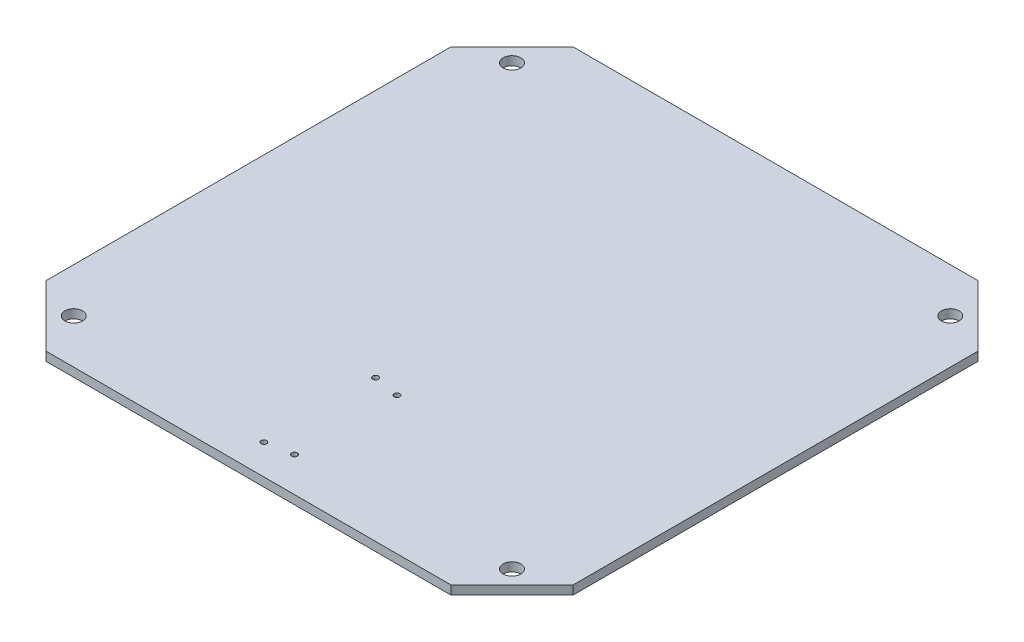
ISO-10303-21;
HEADER;
FILE_DESCRIPTION(('STEP AP214'),'2;1');
FILE_NAME('part.step','',(''),(''),'','','');
FILE_SCHEMA(('AUTOMOTIVE_DESIGN { 1 0 10303 214 1 1 1 1 }'));
ENDSEC;
DATA;
#1=APPLICATION_CONTEXT('core data for automotive mechanical design processes');
#2=APPLICATION_PROTOCOL_DEFINITION('international standard','automotive_design',2000,#1);
#3=PRODUCT_CONTEXT('',#1,'mechanical');
#4=PRODUCT('Part','Part','',(#3));
#5=PRODUCT_RELATED_PRODUCT_CATEGORY('part','',(#4));
#6=PRODUCT_DEFINITION_FORMATION('','',#4);
#7=PRODUCT_DEFINITION_CONTEXT('part definition',#1,'design');
#8=PRODUCT_DEFINITION('design','',#6,#7);
#9=PRODUCT_DEFINITION_SHAPE('','',#8);
#10=(LENGTH_UNIT() NAMED_UNIT(*) SI_UNIT(.MILLI.,.METRE.));
#11=(NAMED_UNIT(*) PLANE_ANGLE_UNIT() SI_UNIT($,.RADIAN.));
#12=(NAMED_UNIT(*) SI_UNIT($,.STERADIAN.) SOLID_ANGLE_UNIT());
#13=UNCERTAINTY_MEASURE_WITH_UNIT(LENGTH_MEASURE(1.E-05),#10,'distance_accuracy_value','');
#14=(GEOMETRIC_REPRESENTATION_CONTEXT(3) GLOBAL_UNCERTAINTY_ASSIGNED_CONTEXT((#13)) GLOBAL_UNIT_ASSIGNED_CONTEXT((#10,
#11,#12)) REPRESENTATION_CONTEXT('',''));
#15=CARTESIAN_POINT('',(0.,0.,0.));
#16=DIRECTION('',(0.,0.,1.));
#17=DIRECTION('',(1.,0.,0.));
#18=AXIS2_PLACEMENT_3D('',#15,#16,#17);
#19=CARTESIAN_POINT('',(-47.5,1.59,-36.5));
#20=DIRECTION('',(-0.707106781186547,0.,-0.707106781186547));
#21=DIRECTION('',(-0.707106781186548,0.,0.707106781186548));
#22=AXIS2_PLACEMENT_3D('',#19,#20,#21);
#23=PLANE('',#22);
#24=DIRECTION('',(0.707106781186547,0.,-0.707106781186547));
#25=VECTOR('',#24,1.);
#26=CARTESIAN_POINT('',(-47.5,0.,-36.5));
#27=LINE('',#26,#25);
#28=CARTESIAN_POINT('',(-47.5,0.,-36.5));
#29=VERTEX_POINT('',#28);
#30=CARTESIAN_POINT('',(-36.5,0.,-47.5));
#31=VERTEX_POINT('',#30);
#32=EDGE_CURVE('E142',#29,#31,#27,.T.);
#33=ORIENTED_EDGE('',*,*,#32,.F.);
#34=DIRECTION('',(0.,-1.,0.));
#35=VECTOR('',#34,1.);
#36=CARTESIAN_POINT('',(-47.5,1.59,-36.5));
#37=LINE('',#36,#35);
#38=CARTESIAN_POINT('',(-47.5,1.59,-36.5));
#39=VERTEX_POINT('',#38);
#40=EDGE_CURVE('E11',#39,#29,#37,.T.);
#41=ORIENTED_EDGE('',*,*,#40,.F.);
#42=DIRECTION('',(0.707106781186547,0.,-0.707106781186547));
#43=VECTOR('',#42,1.);
#44=CARTESIAN_POINT('',(-47.5,1.59,-36.5));
#45=LINE('',#44,#43);
#46=CARTESIAN_POINT('',(-36.5,1.59,-47.5));
#47=VERTEX_POINT('',#46);
#48=EDGE_CURVE('E170',#39,#47,#45,.T.);
#49=ORIENTED_EDGE('',*,*,#48,.T.);
#50=DIRECTION('',(0.,-1.,0.));
#51=VECTOR('',#50,1.);
#52=CARTESIAN_POINT('',(-36.5,1.59,-47.5));
#53=LINE('',#52,#51);
#54=EDGE_CURVE('E44',#47,#31,#53,.T.);
#55=ORIENTED_EDGE('',*,*,#54,.T.);
#56=EDGE_LOOP('',(#33,#41,#49,#55));
#57=FACE_BOUND('',#56,.T.);
#58=ADVANCED_FACE('F41',(#57),#23,.T.);
#59=CARTESIAN_POINT('',(-47.5,1.59,-36.5));
#60=DIRECTION('',(1.,0.,0.));
#61=DIRECTION('',(0.,0.,-1.));
#62=AXIS2_PLACEMENT_3D('',#59,#60,#61);
#63=PLANE('',#62);
#64=DIRECTION('',(0.,0.,1.));
#65=VECTOR('',#64,1.);
#66=CARTESIAN_POINT('',(-47.5,0.,-36.5));
#67=LINE('',#66,#65);
#68=CARTESIAN_POINT('',(-47.5,0.,36.5));
#69=VERTEX_POINT('',#68);
#70=EDGE_CURVE('E168',#29,#69,#67,.T.);
#71=ORIENTED_EDGE('',*,*,#70,.T.);
#72=DIRECTION('',(0.,-1.,0.));
#73=VECTOR('',#72,1.);
#74=CARTESIAN_POINT('',(-47.5,1.59,36.5));
#75=LINE('',#74,#73);
#76=CARTESIAN_POINT('',(-47.5,1.59,36.5));
#77=VERTEX_POINT('',#76);
#78=EDGE_CURVE('E51',#77,#69,#75,.T.);
#79=ORIENTED_EDGE('',*,*,#78,.F.);
#80=DIRECTION('',(0.,0.,1.));
#81=VECTOR('',#80,1.);
#82=CARTESIAN_POINT('',(-47.5,1.59,-36.5));
#83=LINE('',#82,#81);
#84=EDGE_CURVE('E135',#39,#77,#83,.T.);
#85=ORIENTED_EDGE('',*,*,#84,.F.);
#86=ORIENTED_EDGE('',*,*,#40,.T.);
#87=EDGE_LOOP('',(#71,#79,#85,#86));
#88=FACE_BOUND('',#87,.T.);
#89=ADVANCED_FACE('F188',(#88),#63,.F.);
#90=CARTESIAN_POINT('',(-36.5,1.59,47.5));
#91=DIRECTION('',(-0.707106781186547,0.,0.707106781186547));
#92=DIRECTION('',(0.707106781186548,0.,0.707106781186548));
#93=AXIS2_PLACEMENT_3D('',#90,#91,#92);
#94=PLANE('',#93);
#95=DIRECTION('',(-0.707106781186547,0.,-0.707106781186547));
#96=VECTOR('',#95,1.);
#97=CARTESIAN_POINT('',(-36.5,0.,47.5));
#98=LINE('',#97,#96);
#99=CARTESIAN_POINT('',(-36.5,0.,47.5));
#100=VERTEX_POINT('',#99);
#101=EDGE_CURVE('E117',#100,#69,#98,.T.);
#102=ORIENTED_EDGE('',*,*,#101,.F.);
#103=DIRECTION('',(0.,-1.,0.));
#104=VECTOR('',#103,1.);
#105=CARTESIAN_POINT('',(-36.5,1.59,47.5));
#106=LINE('',#105,#104);
#107=CARTESIAN_POINT('',(-36.5,1.59,47.5));
#108=VERTEX_POINT('',#107);
#109=EDGE_CURVE('E111',#108,#100,#106,.T.);
#110=ORIENTED_EDGE('',*,*,#109,.F.);
#111=DIRECTION('',(-0.707106781186547,0.,-0.707106781186547));
#112=VECTOR('',#111,1.);
#113=CARTESIAN_POINT('',(-36.5,1.59,47.5));
#114=LINE('',#113,#112);
#115=EDGE_CURVE('E115',#108,#77,#114,.T.);
#116=ORIENTED_EDGE('',*,*,#115,.T.);
#117=ORIENTED_EDGE('',*,*,#78,.T.);
#118=EDGE_LOOP('',(#102,#110,#116,#117));
#119=FACE_BOUND('',#118,.T.);
#120=ADVANCED_FACE('F113',(#119),#94,.T.);
#121=CARTESIAN_POINT('',(-36.5,1.59,47.5));
#122=DIRECTION('',(0.,0.,-1.));
#123=DIRECTION('',(-1.,0.,0.));
#124=AXIS2_PLACEMENT_3D('',#121,#122,#123);
#125=PLANE('',#124);
#126=DIRECTION('',(1.,0.,0.));
#127=VECTOR('',#126,1.);
#128=CARTESIAN_POINT('',(-36.5,0.,47.5));
#129=LINE('',#128,#127);
#130=CARTESIAN_POINT('',(36.5,0.,47.5));
#131=VERTEX_POINT('',#130);
#132=EDGE_CURVE('E163',#100,#131,#129,.T.);
#133=ORIENTED_EDGE('',*,*,#132,.T.);
#134=DIRECTION('',(0.,-1.,0.));
#135=VECTOR('',#134,1.);
#136=CARTESIAN_POINT('',(36.5,1.59,47.5));
#137=LINE('',#136,#135);
#138=CARTESIAN_POINT('',(36.5,1.59,47.5));
#139=VERTEX_POINT('',#138);
#140=EDGE_CURVE('E122',#139,#131,#137,.T.);
#141=ORIENTED_EDGE('',*,*,#140,.F.);
#142=DIRECTION('',(1.,0.,0.));
#143=VECTOR('',#142,1.);
#144=CARTESIAN_POINT('',(-36.5,1.59,47.5));
#145=LINE('',#144,#143);
#146=EDGE_CURVE('E125',#108,#139,#145,.T.);
#147=ORIENTED_EDGE('',*,*,#146,.F.);
#148=ORIENTED_EDGE('',*,*,#109,.T.);
#149=EDGE_LOOP('',(#133,#141,#147,#148));
#150=FACE_BOUND('',#149,.T.);
#151=ADVANCED_FACE('F126',(#150),#125,.F.);
#152=CARTESIAN_POINT('',(47.5,1.59,36.5));
#153=DIRECTION('',(0.707106781186547,0.,0.707106781186547));
#154=DIRECTION('',(0.707106781186548,0.,-0.707106781186548));
#155=AXIS2_PLACEMENT_3D('',#152,#153,#154);
#156=PLANE('',#155);
#157=DIRECTION('',(-0.707106781186547,0.,0.707106781186547));
#158=VECTOR('',#157,1.);
#159=CARTESIAN_POINT('',(47.5,0.,36.5));
#160=LINE('',#159,#158);
#161=CARTESIAN_POINT('',(47.5,0.,36.5));
#162=VERTEX_POINT('',#161);
#163=EDGE_CURVE('E159',#162,#131,#160,.T.);
#164=ORIENTED_EDGE('',*,*,#163,.F.);
#165=DIRECTION('',(0.,-1.,0.));
#166=VECTOR('',#165,1.);
#167=CARTESIAN_POINT('',(47.5,1.59,36.5));
#168=LINE('',#167,#166);
#169=CARTESIAN_POINT('',(47.5,1.59,36.5));
#170=VERTEX_POINT('',#169);
#171=EDGE_CURVE('E176',#170,#162,#168,.T.);
#172=ORIENTED_EDGE('',*,*,#171,.F.);
#173=DIRECTION('',(-0.707106781186547,0.,0.707106781186547));
#174=VECTOR('',#173,1.);
#175=CARTESIAN_POINT('',(47.5,1.59,36.5));
#176=LINE('',#175,#174);
#177=EDGE_CURVE('E131',#170,#139,#176,.T.);
#178=ORIENTED_EDGE('',*,*,#177,.T.);
#179=ORIENTED_EDGE('',*,*,#140,.T.);
#180=EDGE_LOOP('',(#164,#172,#178,#179));
#181=FACE_BOUND('',#180,.T.);
#182=ADVANCED_FACE('F209',(#181),#156,.T.);
#183=CARTESIAN_POINT('',(47.5,1.59,-36.5));
#184=DIRECTION('',(1.,0.,0.));
#185=DIRECTION('',(0.,0.,-1.));
#186=AXIS2_PLACEMENT_3D('',#183,#184,#185);
#187=PLANE('',#186);
#188=DIRECTION('',(0.,0.,1.));
#189=VECTOR('',#188,1.);
#190=CARTESIAN_POINT('',(47.5,0.,-36.5));
#191=LINE('',#190,#189);
#192=CARTESIAN_POINT('',(47.5,0.,-36.5));
#193=VERTEX_POINT('',#192);
#194=EDGE_CURVE('E155',#193,#162,#191,.T.);
#195=ORIENTED_EDGE('',*,*,#194,.F.);
#196=DIRECTION('',(0.,-1.,0.));
#197=VECTOR('',#196,1.);
#198=CARTESIAN_POINT('',(47.5,1.59,-36.5));
#199=LINE('',#198,#197);
#200=CARTESIAN_POINT('',(47.5,1.59,-36.5));
#201=VERTEX_POINT('',#200);
#202=EDGE_CURVE('E179',#201,#193,#199,.T.);
#203=ORIENTED_EDGE('',*,*,#202,.F.);
#204=DIRECTION('',(0.,0.,1.));
#205=VECTOR('',#204,1.);
#206=CARTESIAN_POINT('',(47.5,1.59,-36.5));
#207=LINE('',#206,#205);
#208=EDGE_CURVE('E203',#201,#170,#207,.T.);
#209=ORIENTED_EDGE('',*,*,#208,.T.);
#210=ORIENTED_EDGE('',*,*,#171,.T.);
#211=EDGE_LOOP('',(#195,#203,#209,#210));
#212=FACE_BOUND('',#211,.T.);
#213=ADVANCED_FACE('F213',(#212),#187,.T.);
#214=CARTESIAN_POINT('',(36.5,1.59,-47.5));
#215=DIRECTION('',(0.707106781186547,0.,-0.707106781186547));
#216=DIRECTION('',(-0.707106781186548,0.,-0.707106781186548));
#217=AXIS2_PLACEMENT_3D('',#214,#215,#216);
#218=PLANE('',#217);
#219=DIRECTION('',(0.707106781186547,0.,0.707106781186547));
#220=VECTOR('',#219,1.);
#221=CARTESIAN_POINT('',(36.5,0.,-47.5));
#222=LINE('',#221,#220);
#223=CARTESIAN_POINT('',(36.5,0.,-47.5));
#224=VERTEX_POINT('',#223);
#225=EDGE_CURVE('E151',#224,#193,#222,.T.);
#226=ORIENTED_EDGE('',*,*,#225,.F.);
#227=DIRECTION('',(0.,-1.,0.));
#228=VECTOR('',#227,1.);
#229=CARTESIAN_POINT('',(36.5,1.59,-47.5));
#230=LINE('',#229,#228);
#231=CARTESIAN_POINT('',(36.5,1.59,-47.5));
#232=VERTEX_POINT('',#231);
#233=EDGE_CURVE('E181',#232,#224,#230,.T.);
#234=ORIENTED_EDGE('',*,*,#233,.F.);
#235=DIRECTION('',(0.707106781186547,0.,0.707106781186547));
#236=VECTOR('',#235,1.);
#237=CARTESIAN_POINT('',(36.5,1.59,-47.5));
#238=LINE('',#237,#236);
#239=EDGE_CURVE('E194',#232,#201,#238,.T.);
#240=ORIENTED_EDGE('',*,*,#239,.T.);
#241=ORIENTED_EDGE('',*,*,#202,.T.);
#242=EDGE_LOOP('',(#226,#234,#240,#241));
#243=FACE_BOUND('',#242,.T.);
#244=ADVANCED_FACE('F215',(#243),#218,.T.);
#245=CARTESIAN_POINT('',(-36.5,1.59,-47.5));
#246=DIRECTION('',(0.,0.,-1.));
#247=DIRECTION('',(-1.,0.,0.));
#248=AXIS2_PLACEMENT_3D('',#245,#246,#247);
#249=PLANE('',#248);
#250=DIRECTION('',(1.,0.,0.));
#251=VECTOR('',#250,1.);
#252=CARTESIAN_POINT('',(-36.5,0.,-47.5));
#253=LINE('',#252,#251);
#254=EDGE_CURVE('E146',#31,#224,#253,.T.);
#255=ORIENTED_EDGE('',*,*,#254,.F.);
#256=ORIENTED_EDGE('',*,*,#54,.F.);
#257=DIRECTION('',(1.,0.,0.));
#258=VECTOR('',#257,1.);
#259=CARTESIAN_POINT('',(-36.5,1.59,-47.5));
#260=LINE('',#259,#258);
#261=EDGE_CURVE('E190',#47,#232,#260,.T.);
#262=ORIENTED_EDGE('',*,*,#261,.T.);
#263=ORIENTED_EDGE('',*,*,#233,.T.);
#264=EDGE_LOOP('',(#255,#256,#262,#263));
#265=FACE_BOUND('',#264,.T.);
#266=ADVANCED_FACE('F185',(#265),#249,.T.);
#267=CARTESIAN_POINT('',(0.,1.59,0.));
#268=DIRECTION('',(0.,-1.,0.));
#269=DIRECTION('',(0.,0.,-1.));
#270=AXIS2_PLACEMENT_3D('',#267,#268,#269);
#271=PLANE('',#270);
#272=CARTESIAN_POINT('',(-39.5,1.59,39.5));
#273=DIRECTION('',(0.,1.,0.));
#274=DIRECTION('',(0.,0.,1.));
#275=AXIS2_PLACEMENT_3D('',#272,#273,#274);
#276=CIRCLE('',#275,1.59);
#277=CARTESIAN_POINT('',(-39.5,1.59,41.09));
#278=VERTEX_POINT('',#277);
#279=EDGE_CURVE('E362',#278,#278,#276,.T.);
#280=ORIENTED_EDGE('',*,*,#279,.F.);
#281=EDGE_LOOP('',(#280));
#282=FACE_BOUND('',#281,.T.);
#283=CARTESIAN_POINT('',(39.5,1.59,39.5));
#284=DIRECTION('',(0.,1.,0.));
#285=DIRECTION('',(0.,0.,1.));
#286=AXIS2_PLACEMENT_3D('',#283,#284,#285);
#287=CIRCLE('',#286,1.59);
#288=CARTESIAN_POINT('',(39.5,1.59,41.09));
#289=VERTEX_POINT('',#288);
#290=EDGE_CURVE('E370',#289,#289,#287,.T.);
#291=ORIENTED_EDGE('',*,*,#290,.F.);
#292=EDGE_LOOP('',(#291));
#293=FACE_BOUND('',#292,.T.);
#294=CARTESIAN_POINT('',(39.5,1.59,-39.5));
#295=DIRECTION('',(0.,1.,0.));
#296=DIRECTION('',(0.,0.,1.));
#297=AXIS2_PLACEMENT_3D('',#294,#295,#296);
#298=CIRCLE('',#297,1.59);
#299=CARTESIAN_POINT('',(39.5,1.59,-37.91));
#300=VERTEX_POINT('',#299);
#301=EDGE_CURVE('E381',#300,#300,#298,.T.);
#302=ORIENTED_EDGE('',*,*,#301,.F.);
#303=EDGE_LOOP('',(#302));
#304=FACE_BOUND('',#303,.T.);
#305=CARTESIAN_POINT('',(-2.67000000000001,1.59,21.93));
#306=DIRECTION('',(0.,1.,0.));
#307=DIRECTION('',(0.,0.,1.));
#308=AXIS2_PLACEMENT_3D('',#305,#306,#307);
#309=CIRCLE('',#308,0.509999999999999);
#310=CARTESIAN_POINT('',(-2.67000000000001,1.59,22.44));
#311=VERTEX_POINT('',#310);
#312=EDGE_CURVE('E389',#311,#311,#309,.T.);
#313=ORIENTED_EDGE('',*,*,#312,.F.);
#314=EDGE_LOOP('',(#313));
#315=FACE_BOUND('',#314,.T.);
#316=CARTESIAN_POINT('',(2.03,1.59,41.24));
#317=DIRECTION('',(0.,1.,0.));
#318=DIRECTION('',(0.,0.,1.));
#319=AXIS2_PLACEMENT_3D('',#316,#317,#318);
#320=CIRCLE('',#319,0.510000000000001);
#321=CARTESIAN_POINT('',(2.03,1.59,41.75));
#322=VERTEX_POINT('',#321);
#323=EDGE_CURVE('E415',#322,#322,#320,.T.);
#324=ORIENTED_EDGE('',*,*,#323,.F.);
#325=EDGE_LOOP('',(#324));
#326=FACE_BOUND('',#325,.T.);
#327=CARTESIAN_POINT('',(-2.67000000000001,1.59,42.07));
#328=DIRECTION('',(0.,1.,0.));
#329=DIRECTION('',(0.,0.,1.));
#330=AXIS2_PLACEMENT_3D('',#327,#328,#329);
#331=CIRCLE('',#330,0.510000000000001);
#332=CARTESIAN_POINT('',(-2.67000000000001,1.59,42.58));
#333=VERTEX_POINT('',#332);
#334=EDGE_CURVE('E420',#333,#333,#331,.T.);
#335=ORIENTED_EDGE('',*,*,#334,.F.);
#336=EDGE_LOOP('',(#335));
#337=FACE_BOUND('',#336,.T.);
#338=CARTESIAN_POINT('',(2.03,1.59,22.75));
#339=DIRECTION('',(0.,1.,0.));
#340=DIRECTION('',(0.,0.,1.));
#341=AXIS2_PLACEMENT_3D('',#338,#339,#340);
#342=CIRCLE('',#341,0.509999999999999);
#343=CARTESIAN_POINT('',(2.03,1.59,23.26));
#344=VERTEX_POINT('',#343);
#345=EDGE_CURVE('E406',#344,#344,#342,.T.);
#346=ORIENTED_EDGE('',*,*,#345,.F.);
#347=EDGE_LOOP('',(#346));
#348=FACE_BOUND('',#347,.T.);
#349=CARTESIAN_POINT('',(-39.5,1.59,-39.5));
#350=DIRECTION('',(0.,1.,0.));
#351=DIRECTION('',(0.,0.,1.));
#352=AXIS2_PLACEMENT_3D('',#349,#350,#351);
#353=CIRCLE('',#352,1.59);
#354=CARTESIAN_POINT('',(-39.5,1.59,-37.91));
#355=VERTEX_POINT('',#354);
#356=EDGE_CURVE('E197',#355,#355,#353,.T.);
#357=ORIENTED_EDGE('',*,*,#356,.F.);
#358=EDGE_LOOP('',(#357));
#359=FACE_BOUND('',#358,.T.);
#360=ORIENTED_EDGE('',*,*,#48,.F.);
#361=ORIENTED_EDGE('',*,*,#84,.T.);
#362=ORIENTED_EDGE('',*,*,#115,.F.);
#363=ORIENTED_EDGE('',*,*,#146,.T.);
#364=ORIENTED_EDGE('',*,*,#177,.F.);
#365=ORIENTED_EDGE('',*,*,#208,.F.);
#366=ORIENTED_EDGE('',*,*,#239,.F.);
#367=ORIENTED_EDGE('',*,*,#261,.F.);
#368=EDGE_LOOP('',(#360,#361,#362,#363,#364,#365,#366,#367));
#369=FACE_BOUND('',#368,.T.);
#370=ADVANCED_FACE('F134',(#282,#293,#304,#315,#326,#337,#348,#359,#369),#271,.F.);
#371=CARTESIAN_POINT('',(0.,0.,0.));
#372=DIRECTION('',(0.,-1.,0.));
#373=DIRECTION('',(0.,0.,-1.));
#374=AXIS2_PLACEMENT_3D('',#371,#372,#373);
#375=PLANE('',#374);
#376=CARTESIAN_POINT('',(-39.5,0.,39.5));
#377=DIRECTION('',(0.,1.,0.));
#378=DIRECTION('',(0.,0.,1.));
#379=AXIS2_PLACEMENT_3D('',#376,#377,#378);
#380=CIRCLE('',#379,1.59);
#381=CARTESIAN_POINT('',(-39.5,0.,41.09));
#382=VERTEX_POINT('',#381);
#383=EDGE_CURVE('E359',#382,#382,#380,.T.);
#384=ORIENTED_EDGE('',*,*,#383,.T.);
#385=EDGE_LOOP('',(#384));
#386=FACE_BOUND('',#385,.T.);
#387=CARTESIAN_POINT('',(39.5,0.,39.5));
#388=DIRECTION('',(0.,1.,0.));
#389=DIRECTION('',(0.,0.,1.));
#390=AXIS2_PLACEMENT_3D('',#387,#388,#389);
#391=CIRCLE('',#390,1.59);
#392=CARTESIAN_POINT('',(39.5,0.,41.09));
#393=VERTEX_POINT('',#392);
#394=EDGE_CURVE('E364',#393,#393,#391,.T.);
#395=ORIENTED_EDGE('',*,*,#394,.T.);
#396=EDGE_LOOP('',(#395));
#397=FACE_BOUND('',#396,.T.);
#398=CARTESIAN_POINT('',(39.5,0.,-39.5));
#399=DIRECTION('',(0.,1.,0.));
#400=DIRECTION('',(0.,0.,1.));
#401=AXIS2_PLACEMENT_3D('',#398,#399,#400);
#402=CIRCLE('',#401,1.59);
#403=CARTESIAN_POINT('',(39.5,0.,-37.91));
#404=VERTEX_POINT('',#403);
#405=EDGE_CURVE('E377',#404,#404,#402,.T.);
#406=ORIENTED_EDGE('',*,*,#405,.T.);
#407=EDGE_LOOP('',(#406));
#408=FACE_BOUND('',#407,.T.);
#409=CARTESIAN_POINT('',(-2.67000000000001,0.,21.93));
#410=DIRECTION('',(0.,1.,0.));
#411=DIRECTION('',(0.,0.,1.));
#412=AXIS2_PLACEMENT_3D('',#409,#410,#411);
#413=CIRCLE('',#412,0.509999999999999);
#414=CARTESIAN_POINT('',(-2.67000000000001,0.,22.44));
#415=VERTEX_POINT('',#414);
#416=EDGE_CURVE('E385',#415,#415,#413,.T.);
#417=ORIENTED_EDGE('',*,*,#416,.T.);
#418=EDGE_LOOP('',(#417));
#419=FACE_BOUND('',#418,.T.);
#420=CARTESIAN_POINT('',(2.03,0.,41.24));
#421=DIRECTION('',(0.,1.,0.));
#422=DIRECTION('',(0.,0.,1.));
#423=AXIS2_PLACEMENT_3D('',#420,#421,#422);
#424=CIRCLE('',#423,0.510000000000001);
#425=CARTESIAN_POINT('',(2.03,0.,41.75));
#426=VERTEX_POINT('',#425);
#427=EDGE_CURVE('E423',#426,#426,#424,.T.);
#428=ORIENTED_EDGE('',*,*,#427,.T.);
#429=EDGE_LOOP('',(#428));
#430=FACE_BOUND('',#429,.T.);
#431=CARTESIAN_POINT('',(-2.67000000000001,0.,42.07));
#432=DIRECTION('',(0.,1.,0.));
#433=DIRECTION('',(0.,0.,1.));
#434=AXIS2_PLACEMENT_3D('',#431,#432,#433);
#435=CIRCLE('',#434,0.510000000000001);
#436=CARTESIAN_POINT('',(-2.67000000000001,0.,42.58));
#437=VERTEX_POINT('',#436);
#438=EDGE_CURVE('E412',#437,#437,#435,.T.);
#439=ORIENTED_EDGE('',*,*,#438,.T.);
#440=EDGE_LOOP('',(#439));
#441=FACE_BOUND('',#440,.T.);
#442=CARTESIAN_POINT('',(2.03,0.,22.75));
#443=DIRECTION('',(0.,1.,0.));
#444=DIRECTION('',(0.,0.,1.));
#445=AXIS2_PLACEMENT_3D('',#442,#443,#444);
#446=CIRCLE('',#445,0.509999999999999);
#447=CARTESIAN_POINT('',(2.03,0.,23.26));
#448=VERTEX_POINT('',#447);
#449=EDGE_CURVE('E392',#448,#448,#446,.T.);
#450=ORIENTED_EDGE('',*,*,#449,.T.);
#451=EDGE_LOOP('',(#450));
#452=FACE_BOUND('',#451,.T.);
#453=CARTESIAN_POINT('',(-39.5,0.,-39.5));
#454=DIRECTION('',(0.,1.,0.));
#455=DIRECTION('',(0.,0.,1.));
#456=AXIS2_PLACEMENT_3D('',#453,#454,#455);
#457=CIRCLE('',#456,1.59);
#458=CARTESIAN_POINT('',(-39.5,0.,-37.91));
#459=VERTEX_POINT('',#458);
#460=EDGE_CURVE('E147',#459,#459,#457,.T.);
#461=ORIENTED_EDGE('',*,*,#460,.T.);
#462=EDGE_LOOP('',(#461));
#463=FACE_BOUND('',#462,.T.);
#464=ORIENTED_EDGE('',*,*,#32,.T.);
#465=ORIENTED_EDGE('',*,*,#254,.T.);
#466=ORIENTED_EDGE('',*,*,#225,.T.);
#467=ORIENTED_EDGE('',*,*,#194,.T.);
#468=ORIENTED_EDGE('',*,*,#163,.T.);
#469=ORIENTED_EDGE('',*,*,#132,.F.);
#470=ORIENTED_EDGE('',*,*,#101,.T.);
#471=ORIENTED_EDGE('',*,*,#70,.F.);
#472=EDGE_LOOP('',(#464,#465,#466,#467,#468,#469,#470,#471));
#473=FACE_BOUND('',#472,.T.);
#474=ADVANCED_FACE('F187',(#386,#397,#408,#419,#430,#441,#452,#463,#473),#375,.T.);
#475=CARTESIAN_POINT('',(-39.5,0.,-39.5));
#476=DIRECTION('',(0.,1.,0.));
#477=DIRECTION('',(0.,0.,1.));
#478=AXIS2_PLACEMENT_3D('',#475,#476,#477);
#479=CYLINDRICAL_SURFACE('',#478,1.59);
#480=CARTESIAN_POINT('',(-39.5,0.,-37.91));
#481=CARTESIAN_POINT('',(-39.5,0.0165625,-37.91));
#482=CARTESIAN_POINT('',(-39.5,0.033125,-37.91));
#483=CARTESIAN_POINT('',(-39.5,0.06625,-37.91));
#484=CARTESIAN_POINT('',(-39.5,0.0828125,-37.91));
#485=CARTESIAN_POINT('',(-39.5,0.1159375,-37.91));
#486=CARTESIAN_POINT('',(-39.5,0.1325,-37.91));
#487=CARTESIAN_POINT('',(-39.5,0.165625,-37.91));
#488=CARTESIAN_POINT('',(-39.5,0.1821875,-37.91));
#489=CARTESIAN_POINT('',(-39.5,0.2153125,-37.91));
#490=CARTESIAN_POINT('',(-39.5,0.231875,-37.91));
#491=CARTESIAN_POINT('',(-39.5,0.265,-37.91));
#492=CARTESIAN_POINT('',(-39.5,0.2815625,-37.91));
#493=CARTESIAN_POINT('',(-39.5,0.3146875,-37.91));
#494=CARTESIAN_POINT('',(-39.5,0.33125,-37.91));
#495=CARTESIAN_POINT('',(-39.5,0.364375,-37.91));
#496=CARTESIAN_POINT('',(-39.5,0.3809375,-37.91));
#497=CARTESIAN_POINT('',(-39.5,0.4140625,-37.91));
#498=CARTESIAN_POINT('',(-39.5,0.430625,-37.91));
#499=CARTESIAN_POINT('',(-39.5,0.46375,-37.91));
#500=CARTESIAN_POINT('',(-39.5,0.4803125,-37.91));
#501=CARTESIAN_POINT('',(-39.5,0.5134375,-37.91));
#502=CARTESIAN_POINT('',(-39.5,0.53,-37.91));
#503=CARTESIAN_POINT('',(-39.5,0.563125,-37.91));
#504=CARTESIAN_POINT('',(-39.5,0.5796875,-37.91));
#505=CARTESIAN_POINT('',(-39.5,0.6128125,-37.91));
#506=CARTESIAN_POINT('',(-39.5,0.629375,-37.91));
#507=CARTESIAN_POINT('',(-39.5,0.6625,-37.91));
#508=CARTESIAN_POINT('',(-39.5,0.6790625,-37.91));
#509=CARTESIAN_POINT('',(-39.5,0.7121875,-37.91));
#510=CARTESIAN_POINT('',(-39.5,0.72875,-37.91));
#511=CARTESIAN_POINT('',(-39.5,0.761875,-37.91));
#512=CARTESIAN_POINT('',(-39.5,0.7784375,-37.91));
#513=CARTESIAN_POINT('',(-39.5,0.8115625,-37.91));
#514=CARTESIAN_POINT('',(-39.5,0.828125,-37.91));
#515=CARTESIAN_POINT('',(-39.5,0.86125,-37.91));
#516=CARTESIAN_POINT('',(-39.5,0.8778125,-37.91));
#517=CARTESIAN_POINT('',(-39.5,0.9109375,-37.91));
#518=CARTESIAN_POINT('',(-39.5,0.9275,-37.91));
#519=CARTESIAN_POINT('',(-39.5,0.960625,-37.91));
#520=CARTESIAN_POINT('',(-39.5,0.9771875,-37.91));
#521=CARTESIAN_POINT('',(-39.5,1.0103125,-37.91));
#522=CARTESIAN_POINT('',(-39.5,1.026875,-37.91));
#523=CARTESIAN_POINT('',(-39.5,1.06,-37.91));
#524=CARTESIAN_POINT('',(-39.5,1.0765625,-37.91));
#525=CARTESIAN_POINT('',(-39.5,1.1096875,-37.91));
#526=CARTESIAN_POINT('',(-39.5,1.12625,-37.91));
#527=CARTESIAN_POINT('',(-39.5,1.159375,-37.91));
#528=CARTESIAN_POINT('',(-39.5,1.1759375,-37.91));
#529=CARTESIAN_POINT('',(-39.5,1.2090625,-37.91));
#530=CARTESIAN_POINT('',(-39.5,1.225625,-37.91));
#531=CARTESIAN_POINT('',(-39.5,1.25875,-37.91));
#532=CARTESIAN_POINT('',(-39.5,1.2753125,-37.91));
#533=CARTESIAN_POINT('',(-39.5,1.3084375,-37.91));
#534=CARTESIAN_POINT('',(-39.5,1.325,-37.91));
#535=CARTESIAN_POINT('',(-39.5,1.358125,-37.91));
#536=CARTESIAN_POINT('',(-39.5,1.3746875,-37.91));
#537=CARTESIAN_POINT('',(-39.5,1.4078125,-37.91));
#538=CARTESIAN_POINT('',(-39.5,1.424375,-37.91));
#539=CARTESIAN_POINT('',(-39.5,1.4575,-37.91));
#540=CARTESIAN_POINT('',(-39.5,1.4740625,-37.91));
#541=CARTESIAN_POINT('',(-39.5,1.5071875,-37.91));
#542=CARTESIAN_POINT('',(-39.5,1.52375,-37.91));
#543=CARTESIAN_POINT('',(-39.5,1.556875,-37.91));
#544=CARTESIAN_POINT('',(-39.5,1.5734375,-37.91));
#545=CARTESIAN_POINT('',(-39.5,1.59,-37.91));
#546=B_SPLINE_CURVE_WITH_KNOTS('',3,(#480,#481,#482,#483,#484,#485,#486,#487,#488,#489,#490,
#491,#492,#493,#494,#495,#496,#497,#498,#499,#500,#501,#502,#503,#504,#505,#506,#507,#508,#509,
#510,#511,#512,#513,#514,#515,#516,#517,#518,#519,#520,#521,#522,#523,#524,#525,#526,#527,#528,
#529,#530,#531,#532,#533,#534,#535,#536,#537,#538,#539,#540,#541,#542,#543,#544,#545),
.UNSPECIFIED.,.F.,.F.,(4,2,2,2,2,2,2,2,2,2,2,2,2,2,2,2,2,2,2,2,2,2,2,2,2,2,2,2,2,2,2,2,4),(0.,
0.0496875,0.099375,0.1490625,0.19875,0.2484375,0.298125,0.3478125,0.3975,0.4471875,0.496875,
0.5465625,0.59625,0.6459375,0.695625,0.7453125,0.795,0.8446875,0.894375,0.9440625,0.99375,
1.0434375,1.093125,1.1428125,1.1925,1.2421875,1.291875,1.3415625,1.39125,1.4409375,1.490625,
1.5403125,1.59),.UNSPECIFIED.);
#547=EDGE_CURVE('BSEAM273',#459,#355,#546,.T.);
#548=ORIENTED_EDGE('',*,*,#460,.F.);
#549=ORIENTED_EDGE('',*,*,#356,.T.);
#550=ORIENTED_EDGE('',*,*,#547,.T.);
#551=ORIENTED_EDGE('',*,*,#547,.F.);
#552=EDGE_LOOP('',(#548,#550,#549,#551));
#553=FACE_BOUND('',#552,.T.);
#554=ADVANCED_FACE('F273',(#553),#479,.F.);
#555=CARTESIAN_POINT('',(2.03,0.,22.75));
#556=DIRECTION('',(0.,1.,0.));
#557=DIRECTION('',(0.,0.,1.));
#558=AXIS2_PLACEMENT_3D('',#555,#556,#557);
#559=CYLINDRICAL_SURFACE('',#558,0.509999999999999);
#560=ORIENTED_EDGE('',*,*,#449,.F.);
#561=EDGE_LOOP('',(#560));
#562=FACE_BOUND('',#561,.T.);
#563=ORIENTED_EDGE('',*,*,#345,.T.);
#564=EDGE_LOOP('',(#563));
#565=FACE_BOUND('',#564,.T.);
#566=ADVANCED_FACE('F282',(#562,#565),#559,.F.);
#567=CARTESIAN_POINT('',(-2.67000000000001,0.,42.07));
#568=DIRECTION('',(0.,1.,0.));
#569=DIRECTION('',(0.,0.,1.));
#570=AXIS2_PLACEMENT_3D('',#567,#568,#569);
#571=CYLINDRICAL_SURFACE('',#570,0.510000000000001);
#572=ORIENTED_EDGE('',*,*,#438,.F.);
#573=EDGE_LOOP('',(#572));
#574=FACE_BOUND('',#573,.T.);
#575=ORIENTED_EDGE('',*,*,#334,.T.);
#576=EDGE_LOOP('',(#575));
#577=FACE_BOUND('',#576,.T.);
#578=ADVANCED_FACE('F292',(#574,#577),#571,.F.);
#579=CARTESIAN_POINT('',(2.03,0.,41.24));
#580=DIRECTION('',(0.,1.,0.));
#581=DIRECTION('',(0.,0.,1.));
#582=AXIS2_PLACEMENT_3D('',#579,#580,#581);
#583=CYLINDRICAL_SURFACE('',#582,0.510000000000001);
#584=ORIENTED_EDGE('',*,*,#427,.F.);
#585=EDGE_LOOP('',(#584));
#586=FACE_BOUND('',#585,.T.);
#587=ORIENTED_EDGE('',*,*,#323,.T.);
#588=EDGE_LOOP('',(#587));
#589=FACE_BOUND('',#588,.T.);
#590=ADVANCED_FACE('F302',(#586,#589),#583,.F.);
#591=CARTESIAN_POINT('',(-2.67000000000001,0.,21.93));
#592=DIRECTION('',(0.,1.,0.));
#593=DIRECTION('',(0.,0.,1.));
#594=AXIS2_PLACEMENT_3D('',#591,#592,#593);
#595=CYLINDRICAL_SURFACE('',#594,0.509999999999999);
#596=ORIENTED_EDGE('',*,*,#416,.F.);
#597=EDGE_LOOP('',(#596));
#598=FACE_BOUND('',#597,.T.);
#599=ORIENTED_EDGE('',*,*,#312,.T.);
#600=EDGE_LOOP('',(#599));
#601=FACE_BOUND('',#600,.T.);
#602=ADVANCED_FACE('F312',(#598,#601),#595,.F.);
#603=CARTESIAN_POINT('',(39.5,0.,-39.5));
#604=DIRECTION('',(0.,1.,0.));
#605=DIRECTION('',(0.,0.,1.));
#606=AXIS2_PLACEMENT_3D('',#603,#604,#605);
#607=CYLINDRICAL_SURFACE('',#606,1.59);
#608=CARTESIAN_POINT('',(39.5,0.,-37.91));
#609=CARTESIAN_POINT('',(39.5,0.0165625,-37.91));
#610=CARTESIAN_POINT('',(39.5,0.033125,-37.91));
#611=CARTESIAN_POINT('',(39.5,0.06625,-37.91));
#612=CARTESIAN_POINT('',(39.5,0.0828125,-37.91));
#613=CARTESIAN_POINT('',(39.5,0.1159375,-37.91));
#614=CARTESIAN_POINT('',(39.5,0.1325,-37.91));
#615=CARTESIAN_POINT('',(39.5,0.165625,-37.91));
#616=CARTESIAN_POINT('',(39.5,0.1821875,-37.91));
#617=CARTESIAN_POINT('',(39.5,0.2153125,-37.91));
#618=CARTESIAN_POINT('',(39.5,0.231875,-37.91));
#619=CARTESIAN_POINT('',(39.5,0.265,-37.91));
#620=CARTESIAN_POINT('',(39.5,0.2815625,-37.91));
#621=CARTESIAN_POINT('',(39.5,0.3146875,-37.91));
#622=CARTESIAN_POINT('',(39.5,0.33125,-37.91));
#623=CARTESIAN_POINT('',(39.5,0.364375,-37.91));
#624=CARTESIAN_POINT('',(39.5,0.3809375,-37.91));
#625=CARTESIAN_POINT('',(39.5,0.4140625,-37.91));
#626=CARTESIAN_POINT('',(39.5,0.430625,-37.91));
#627=CARTESIAN_POINT('',(39.5,0.46375,-37.91));
#628=CARTESIAN_POINT('',(39.5,0.4803125,-37.91));
#629=CARTESIAN_POINT('',(39.5,0.5134375,-37.91));
#630=CARTESIAN_POINT('',(39.5,0.53,-37.91));
#631=CARTESIAN_POINT('',(39.5,0.563125,-37.91));
#632=CARTESIAN_POINT('',(39.5,0.5796875,-37.91));
#633=CARTESIAN_POINT('',(39.5,0.6128125,-37.91));
#634=CARTESIAN_POINT('',(39.5,0.629375,-37.91));
#635=CARTESIAN_POINT('',(39.5,0.6625,-37.91));
#636=CARTESIAN_POINT('',(39.5,0.6790625,-37.91));
#637=CARTESIAN_POINT('',(39.5,0.7121875,-37.91));
#638=CARTESIAN_POINT('',(39.5,0.72875,-37.91));
#639=CARTESIAN_POINT('',(39.5,0.761875,-37.91));
#640=CARTESIAN_POINT('',(39.5,0.7784375,-37.91));
#641=CARTESIAN_POINT('',(39.5,0.8115625,-37.91));
#642=CARTESIAN_POINT('',(39.5,0.828125,-37.91));
#643=CARTESIAN_POINT('',(39.5,0.86125,-37.91));
#644=CARTESIAN_POINT('',(39.5,0.8778125,-37.91));
#645=CARTESIAN_POINT('',(39.5,0.9109375,-37.91));
#646=CARTESIAN_POINT('',(39.5,0.9275,-37.91));
#647=CARTESIAN_POINT('',(39.5,0.960625,-37.91));
#648=CARTESIAN_POINT('',(39.5,0.9771875,-37.91));
#649=CARTESIAN_POINT('',(39.5,1.0103125,-37.91));
#650=CARTESIAN_POINT('',(39.5,1.026875,-37.91));
#651=CARTESIAN_POINT('',(39.5,1.06,-37.91));
#652=CARTESIAN_POINT('',(39.5,1.0765625,-37.91));
#653=CARTESIAN_POINT('',(39.5,1.1096875,-37.91));
#654=CARTESIAN_POINT('',(39.5,1.12625,-37.91));
#655=CARTESIAN_POINT('',(39.5,1.159375,-37.91));
#656=CARTESIAN_POINT('',(39.5,1.1759375,-37.91));
#657=CARTESIAN_POINT('',(39.5,1.2090625,-37.91));
#658=CARTESIAN_POINT('',(39.5,1.225625,-37.91));
#659=CARTESIAN_POINT('',(39.5,1.25875,-37.91));
#660=CARTESIAN_POINT('',(39.5,1.2753125,-37.91));
#661=CARTESIAN_POINT('',(39.5,1.3084375,-37.91));
#662=CARTESIAN_POINT('',(39.5,1.325,-37.91));
#663=CARTESIAN_POINT('',(39.5,1.358125,-37.91));
#664=CARTESIAN_POINT('',(39.5,1.3746875,-37.91));
#665=CARTESIAN_POINT('',(39.5,1.4078125,-37.91));
#666=CARTESIAN_POINT('',(39.5,1.424375,-37.91));
#667=CARTESIAN_POINT('',(39.5,1.4575,-37.91));
#668=CARTESIAN_POINT('',(39.5,1.4740625,-37.91));
#669=CARTESIAN_POINT('',(39.5,1.5071875,-37.91));
#670=CARTESIAN_POINT('',(39.5,1.52375,-37.91));
#671=CARTESIAN_POINT('',(39.5,1.556875,-37.91));
#672=CARTESIAN_POINT('',(39.5,1.5734375,-37.91));
#673=CARTESIAN_POINT('',(39.5,1.59,-37.91));
#674=B_SPLINE_CURVE_WITH_KNOTS('',3,(#608,#609,#610,#611,#612,#613,#614,#615,#616,#617,#618,
#619,#620,#621,#622,#623,#624,#625,#626,#627,#628,#629,#630,#631,#632,#633,#634,#635,#636,#637,
#638,#639,#640,#641,#642,#643,#644,#645,#646,#647,#648,#649,#650,#651,#652,#653,#654,#655,#656,
#657,#658,#659,#660,#661,#662,#663,#664,#665,#666,#667,#668,#669,#670,#671,#672,#673),
.UNSPECIFIED.,.F.,.F.,(4,2,2,2,2,2,2,2,2,2,2,2,2,2,2,2,2,2,2,2,2,2,2,2,2,2,2,2,2,2,2,2,4),(0.,
0.0496875,0.099375,0.1490625,0.19875,0.2484375,0.298125,0.3478125,0.3975,0.4471875,0.496875,
0.5465625,0.59625,0.6459375,0.695625,0.7453125,0.795,0.8446875,0.894375,0.9440625,0.99375,
1.0434375,1.093125,1.1428125,1.1925,1.2421875,1.291875,1.3415625,1.39125,1.4409375,1.490625,
1.5403125,1.59),.UNSPECIFIED.);
#675=EDGE_CURVE('BSEAM322',#404,#300,#674,.T.);
#676=ORIENTED_EDGE('',*,*,#405,.F.);
#677=ORIENTED_EDGE('',*,*,#301,.T.);
#678=ORIENTED_EDGE('',*,*,#675,.T.);
#679=ORIENTED_EDGE('',*,*,#675,.F.);
#680=EDGE_LOOP('',(#676,#678,#677,#679));
#681=FACE_BOUND('',#680,.T.);
#682=ADVANCED_FACE('F322',(#681),#607,.F.);
#683=CARTESIAN_POINT('',(39.5,0.,39.5));
#684=DIRECTION('',(0.,1.,0.));
#685=DIRECTION('',(0.,0.,1.));
#686=AXIS2_PLACEMENT_3D('',#683,#684,#685);
#687=CYLINDRICAL_SURFACE('',#686,1.59);
#688=CARTESIAN_POINT('',(39.5,0.,41.09));
#689=CARTESIAN_POINT('',(39.5,0.0165625,41.09));
#690=CARTESIAN_POINT('',(39.5,0.033125,41.09));
#691=CARTESIAN_POINT('',(39.5,0.06625,41.09));
#692=CARTESIAN_POINT('',(39.5,0.0828125,41.09));
#693=CARTESIAN_POINT('',(39.5,0.1159375,41.09));
#694=CARTESIAN_POINT('',(39.5,0.1325,41.09));
#695=CARTESIAN_POINT('',(39.5,0.165625,41.09));
#696=CARTESIAN_POINT('',(39.5,0.1821875,41.09));
#697=CARTESIAN_POINT('',(39.5,0.2153125,41.09));
#698=CARTESIAN_POINT('',(39.5,0.231875,41.09));
#699=CARTESIAN_POINT('',(39.5,0.265,41.09));
#700=CARTESIAN_POINT('',(39.5,0.2815625,41.09));
#701=CARTESIAN_POINT('',(39.5,0.3146875,41.09));
#702=CARTESIAN_POINT('',(39.5,0.33125,41.09));
#703=CARTESIAN_POINT('',(39.5,0.364375,41.09));
#704=CARTESIAN_POINT('',(39.5,0.3809375,41.09));
#705=CARTESIAN_POINT('',(39.5,0.4140625,41.09));
#706=CARTESIAN_POINT('',(39.5,0.430625,41.09));
#707=CARTESIAN_POINT('',(39.5,0.46375,41.09));
#708=CARTESIAN_POINT('',(39.5,0.4803125,41.09));
#709=CARTESIAN_POINT('',(39.5,0.5134375,41.09));
#710=CARTESIAN_POINT('',(39.5,0.53,41.09));
#711=CARTESIAN_POINT('',(39.5,0.563125,41.09));
#712=CARTESIAN_POINT('',(39.5,0.5796875,41.09));
#713=CARTESIAN_POINT('',(39.5,0.6128125,41.09));
#714=CARTESIAN_POINT('',(39.5,0.629375,41.09));
#715=CARTESIAN_POINT('',(39.5,0.6625,41.09));
#716=CARTESIAN_POINT('',(39.5,0.6790625,41.09));
#717=CARTESIAN_POINT('',(39.5,0.7121875,41.09));
#718=CARTESIAN_POINT('',(39.5,0.72875,41.09));
#719=CARTESIAN_POINT('',(39.5,0.761875,41.09));
#720=CARTESIAN_POINT('',(39.5,0.7784375,41.09));
#721=CARTESIAN_POINT('',(39.5,0.8115625,41.09));
#722=CARTESIAN_POINT('',(39.5,0.828125,41.09));
#723=CARTESIAN_POINT('',(39.5,0.86125,41.09));
#724=CARTESIAN_POINT('',(39.5,0.8778125,41.09));
#725=CARTESIAN_POINT('',(39.5,0.9109375,41.09));
#726=CARTESIAN_POINT('',(39.5,0.9275,41.09));
#727=CARTESIAN_POINT('',(39.5,0.960625,41.09));
#728=CARTESIAN_POINT('',(39.5,0.9771875,41.09));
#729=CARTESIAN_POINT('',(39.5,1.0103125,41.09));
#730=CARTESIAN_POINT('',(39.5,1.026875,41.09));
#731=CARTESIAN_POINT('',(39.5,1.06,41.09));
#732=CARTESIAN_POINT('',(39.5,1.0765625,41.09));
#733=CARTESIAN_POINT('',(39.5,1.1096875,41.09));
#734=CARTESIAN_POINT('',(39.5,1.12625,41.09));
#735=CARTESIAN_POINT('',(39.5,1.159375,41.09));
#736=CARTESIAN_POINT('',(39.5,1.1759375,41.09));
#737=CARTESIAN_POINT('',(39.5,1.2090625,41.09));
#738=CARTESIAN_POINT('',(39.5,1.225625,41.09));
#739=CARTESIAN_POINT('',(39.5,1.25875,41.09));
#740=CARTESIAN_POINT('',(39.5,1.2753125,41.09));
#741=CARTESIAN_POINT('',(39.5,1.3084375,41.09));
#742=CARTESIAN_POINT('',(39.5,1.325,41.09));
#743=CARTESIAN_POINT('',(39.5,1.358125,41.09));
#744=CARTESIAN_POINT('',(39.5,1.3746875,41.09));
#745=CARTESIAN_POINT('',(39.5,1.4078125,41.09));
#746=CARTESIAN_POINT('',(39.5,1.424375,41.09));
#747=CARTESIAN_POINT('',(39.5,1.4575,41.09));
#748=CARTESIAN_POINT('',(39.5,1.4740625,41.09));
#749=CARTESIAN_POINT('',(39.5,1.5071875,41.09));
#750=CARTESIAN_POINT('',(39.5,1.52375,41.09));
#751=CARTESIAN_POINT('',(39.5,1.556875,41.09));
#752=CARTESIAN_POINT('',(39.5,1.5734375,41.09));
#753=CARTESIAN_POINT('',(39.5,1.59,41.09));
#754=B_SPLINE_CURVE_WITH_KNOTS('',3,(#688,#689,#690,#691,#692,#693,#694,#695,#696,#697,#698,
#699,#700,#701,#702,#703,#704,#705,#706,#707,#708,#709,#710,#711,#712,#713,#714,#715,#716,#717,
#718,#719,#720,#721,#722,#723,#724,#725,#726,#727,#728,#729,#730,#731,#732,#733,#734,#735,#736,
#737,#738,#739,#740,#741,#742,#743,#744,#745,#746,#747,#748,#749,#750,#751,#752,#753),
.UNSPECIFIED.,.F.,.F.,(4,2,2,2,2,2,2,2,2,2,2,2,2,2,2,2,2,2,2,2,2,2,2,2,2,2,2,2,2,2,2,2,4),(0.,
0.0496875,0.099375,0.1490625,0.19875,0.2484375,0.298125,0.3478125,0.3975,0.4471875,0.496875,
0.5465625,0.59625,0.6459375,0.695625,0.7453125,0.795,0.8446875,0.894375,0.9440625,0.99375,
1.0434375,1.093125,1.1428125,1.1925,1.2421875,1.291875,1.3415625,1.39125,1.4409375,1.490625,
1.5403125,1.59),.UNSPECIFIED.);
#755=EDGE_CURVE('BSEAM332',#393,#289,#754,.T.);
#756=ORIENTED_EDGE('',*,*,#394,.F.);
#757=ORIENTED_EDGE('',*,*,#290,.T.);
#758=ORIENTED_EDGE('',*,*,#755,.T.);
#759=ORIENTED_EDGE('',*,*,#755,.F.);
#760=EDGE_LOOP('',(#756,#758,#757,#759));
#761=FACE_BOUND('',#760,.T.);
#762=ADVANCED_FACE('F332',(#761),#687,.F.);
#763=CARTESIAN_POINT('',(-39.5,0.,39.5));
#764=DIRECTION('',(0.,1.,0.));
#765=DIRECTION('',(0.,0.,1.));
#766=AXIS2_PLACEMENT_3D('',#763,#764,#765);
#767=CYLINDRICAL_SURFACE('',#766,1.59);
#768=CARTESIAN_POINT('',(-39.5,0.,41.09));
#769=CARTESIAN_POINT('',(-39.5,0.0165625,41.09));
#770=CARTESIAN_POINT('',(-39.5,0.033125,41.09));
#771=CARTESIAN_POINT('',(-39.5,0.06625,41.09));
#772=CARTESIAN_POINT('',(-39.5,0.0828125,41.09));
#773=CARTESIAN_POINT('',(-39.5,0.1159375,41.09));
#774=CARTESIAN_POINT('',(-39.5,0.1325,41.09));
#775=CARTESIAN_POINT('',(-39.5,0.165625,41.09));
#776=CARTESIAN_POINT('',(-39.5,0.1821875,41.09));
#777=CARTESIAN_POINT('',(-39.5,0.2153125,41.09));
#778=CARTESIAN_POINT('',(-39.5,0.231875,41.09));
#779=CARTESIAN_POINT('',(-39.5,0.265,41.09));
#780=CARTESIAN_POINT('',(-39.5,0.2815625,41.09));
#781=CARTESIAN_POINT('',(-39.5,0.3146875,41.09));
#782=CARTESIAN_POINT('',(-39.5,0.33125,41.09));
#783=CARTESIAN_POINT('',(-39.5,0.364375,41.09));
#784=CARTESIAN_POINT('',(-39.5,0.3809375,41.09));
#785=CARTESIAN_POINT('',(-39.5,0.4140625,41.09));
#786=CARTESIAN_POINT('',(-39.5,0.430625,41.09));
#787=CARTESIAN_POINT('',(-39.5,0.46375,41.09));
#788=CARTESIAN_POINT('',(-39.5,0.4803125,41.09));
#789=CARTESIAN_POINT('',(-39.5,0.5134375,41.09));
#790=CARTESIAN_POINT('',(-39.5,0.53,41.09));
#791=CARTESIAN_POINT('',(-39.5,0.563125,41.09));
#792=CARTESIAN_POINT('',(-39.5,0.5796875,41.09));
#793=CARTESIAN_POINT('',(-39.5,0.6128125,41.09));
#794=CARTESIAN_POINT('',(-39.5,0.629375,41.09));
#795=CARTESIAN_POINT('',(-39.5,0.6625,41.09));
#796=CARTESIAN_POINT('',(-39.5,0.6790625,41.09));
#797=CARTESIAN_POINT('',(-39.5,0.7121875,41.09));
#798=CARTESIAN_POINT('',(-39.5,0.72875,41.09));
#799=CARTESIAN_POINT('',(-39.5,0.761875,41.09));
#800=CARTESIAN_POINT('',(-39.5,0.7784375,41.09));
#801=CARTESIAN_POINT('',(-39.5,0.8115625,41.09));
#802=CARTESIAN_POINT('',(-39.5,0.828125,41.09));
#803=CARTESIAN_POINT('',(-39.5,0.86125,41.09));
#804=CARTESIAN_POINT('',(-39.5,0.8778125,41.09));
#805=CARTESIAN_POINT('',(-39.5,0.9109375,41.09));
#806=CARTESIAN_POINT('',(-39.5,0.9275,41.09));
#807=CARTESIAN_POINT('',(-39.5,0.960625,41.09));
#808=CARTESIAN_POINT('',(-39.5,0.9771875,41.09));
#809=CARTESIAN_POINT('',(-39.5,1.0103125,41.09));
#810=CARTESIAN_POINT('',(-39.5,1.026875,41.09));
#811=CARTESIAN_POINT('',(-39.5,1.06,41.09));
#812=CARTESIAN_POINT('',(-39.5,1.0765625,41.09));
#813=CARTESIAN_POINT('',(-39.5,1.1096875,41.09));
#814=CARTESIAN_POINT('',(-39.5,1.12625,41.09));
#815=CARTESIAN_POINT('',(-39.5,1.159375,41.09));
#816=CARTESIAN_POINT('',(-39.5,1.1759375,41.09));
#817=CARTESIAN_POINT('',(-39.5,1.2090625,41.09));
#818=CARTESIAN_POINT('',(-39.5,1.225625,41.09));
#819=CARTESIAN_POINT('',(-39.5,1.25875,41.09));
#820=CARTESIAN_POINT('',(-39.5,1.2753125,41.09));
#821=CARTESIAN_POINT('',(-39.5,1.3084375,41.09));
#822=CARTESIAN_POINT('',(-39.5,1.325,41.09));
#823=CARTESIAN_POINT('',(-39.5,1.358125,41.09));
#824=CARTESIAN_POINT('',(-39.5,1.3746875,41.09));
#825=CARTESIAN_POINT('',(-39.5,1.4078125,41.09));
#826=CARTESIAN_POINT('',(-39.5,1.424375,41.09));
#827=CARTESIAN_POINT('',(-39.5,1.4575,41.09));
#828=CARTESIAN_POINT('',(-39.5,1.4740625,41.09));
#829=CARTESIAN_POINT('',(-39.5,1.5071875,41.09));
#830=CARTESIAN_POINT('',(-39.5,1.52375,41.09));
#831=CARTESIAN_POINT('',(-39.5,1.556875,41.09));
#832=CARTESIAN_POINT('',(-39.5,1.5734375,41.09));
#833=CARTESIAN_POINT('',(-39.5,1.59,41.09));
#834=B_SPLINE_CURVE_WITH_KNOTS('',3,(#768,#769,#770,#771,#772,#773,#774,#775,#776,#777,#778,
#779,#780,#781,#782,#783,#784,#785,#786,#787,#788,#789,#790,#791,#792,#793,#794,#795,#796,#797,
#798,#799,#800,#801,#802,#803,#804,#805,#806,#807,#808,#809,#810,#811,#812,#813,#814,#815,#816,
#817,#818,#819,#820,#821,#822,#823,#824,#825,#826,#827,#828,#829,#830,#831,#832,#833),
.UNSPECIFIED.,.F.,.F.,(4,2,2,2,2,2,2,2,2,2,2,2,2,2,2,2,2,2,2,2,2,2,2,2,2,2,2,2,2,2,2,2,4),(0.,
0.0496875,0.099375,0.1490625,0.19875,0.2484375,0.298125,0.3478125,0.3975,0.4471875,0.496875,
0.5465625,0.59625,0.6459375,0.695625,0.7453125,0.795,0.8446875,0.894375,0.9440625,0.99375,
1.0434375,1.093125,1.1428125,1.1925,1.2421875,1.291875,1.3415625,1.39125,1.4409375,1.490625,
1.5403125,1.59),.UNSPECIFIED.);
#835=EDGE_CURVE('BSEAM342',#382,#278,#834,.T.);
#836=ORIENTED_EDGE('',*,*,#383,.F.);
#837=ORIENTED_EDGE('',*,*,#279,.T.);
#838=ORIENTED_EDGE('',*,*,#835,.T.);
#839=ORIENTED_EDGE('',*,*,#835,.F.);
#840=EDGE_LOOP('',(#836,#838,#837,#839));
#841=FACE_BOUND('',#840,.T.);
#842=ADVANCED_FACE('F342',(#841),#767,.F.);
#843=CLOSED_SHELL('',(#58,#89,#120,#151,#182,#213,#244,#266,#370,#474,#554,#566,#578,#590,#602,
#682,#762,#842));
#844=MANIFOLD_SOLID_BREP('B2',#843);
#845=ADVANCED_BREP_SHAPE_REPRESENTATION('',(#18,#844),#14);
#846=SHAPE_DEFINITION_REPRESENTATION(#9,#845);
ENDSEC;
END-ISO-10303-21;
